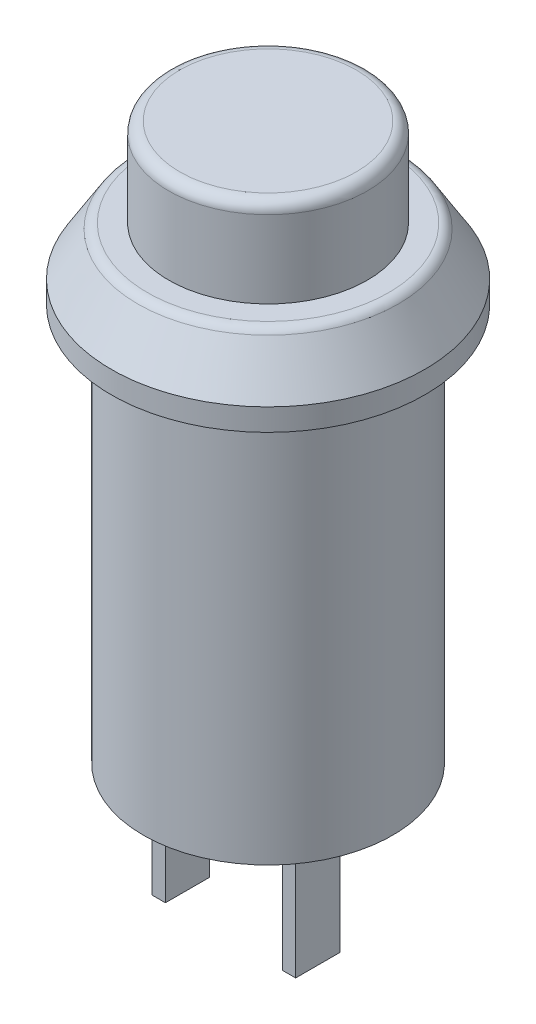
ISO-10303-21;
HEADER;
FILE_DESCRIPTION(('STEP AP214'),'2;1');
FILE_NAME('part.step','',(''),(''),'','','');
FILE_SCHEMA(('AUTOMOTIVE_DESIGN { 1 0 10303 214 1 1 1 1 }'));
ENDSEC;
DATA;
#1=APPLICATION_CONTEXT('core data for automotive mechanical design processes');
#2=APPLICATION_PROTOCOL_DEFINITION('international standard','automotive_design',2000,#1);
#3=PRODUCT_CONTEXT('',#1,'mechanical');
#4=PRODUCT('Part','Part','',(#3));
#5=PRODUCT_RELATED_PRODUCT_CATEGORY('part','',(#4));
#6=PRODUCT_DEFINITION_FORMATION('','',#4);
#7=PRODUCT_DEFINITION_CONTEXT('part definition',#1,'design');
#8=PRODUCT_DEFINITION('design','',#6,#7);
#9=PRODUCT_DEFINITION_SHAPE('','',#8);
#10=(LENGTH_UNIT() NAMED_UNIT(*) SI_UNIT(.MILLI.,.METRE.));
#11=(NAMED_UNIT(*) PLANE_ANGLE_UNIT() SI_UNIT($,.RADIAN.));
#12=(NAMED_UNIT(*) SI_UNIT($,.STERADIAN.) SOLID_ANGLE_UNIT());
#13=UNCERTAINTY_MEASURE_WITH_UNIT(LENGTH_MEASURE(1.E-05),#10,'distance_accuracy_value','');
#14=(GEOMETRIC_REPRESENTATION_CONTEXT(3) GLOBAL_UNCERTAINTY_ASSIGNED_CONTEXT((#13)) GLOBAL_UNIT_ASSIGNED_CONTEXT((#10,
#11,#12)) REPRESENTATION_CONTEXT('',''));
#15=CARTESIAN_POINT('',(0.,0.,0.));
#16=DIRECTION('',(0.,0.,1.));
#17=DIRECTION('',(1.,0.,0.));
#18=AXIS2_PLACEMENT_3D('',#15,#16,#17);
#19=CARTESIAN_POINT('',(0.,0.,0.));
#20=DIRECTION('',(0.,1.,0.));
#21=DIRECTION('',(0.,0.,1.));
#22=AXIS2_PLACEMENT_3D('',#19,#20,#21);
#23=PLANE('',#22);
#24=DIRECTION('',(0.,0.,1.));
#25=VECTOR('',#24,1.);
#26=CARTESIAN_POINT('',(3.25,0.,0.));
#27=LINE('',#26,#25);
#28=CARTESIAN_POINT('',(3.25,0.,0.));
#29=VERTEX_POINT('',#28);
#30=CARTESIAN_POINT('',(3.25,0.,2.));
#31=VERTEX_POINT('',#30);
#32=EDGE_CURVE('E119',#29,#31,#27,.T.);
#33=ORIENTED_EDGE('',*,*,#32,.F.);
#34=DIRECTION('',(1.,0.,0.));
#35=VECTOR('',#34,1.);
#36=CARTESIAN_POINT('',(3.25,0.,0.));
#37=LINE('',#36,#35);
#38=CARTESIAN_POINT('',(2.65,0.,0.));
#39=VERTEX_POINT('',#38);
#40=EDGE_CURVE('E132',#39,#29,#37,.T.);
#41=ORIENTED_EDGE('',*,*,#40,.F.);
#42=DIRECTION('',(0.,0.,-1.));
#43=VECTOR('',#42,1.);
#44=CARTESIAN_POINT('',(2.65,0.,0.));
#45=LINE('',#44,#43);
#46=CARTESIAN_POINT('',(2.65,0.,2.));
#47=VERTEX_POINT('',#46);
#48=EDGE_CURVE('E141',#47,#39,#45,.T.);
#49=ORIENTED_EDGE('',*,*,#48,.F.);
#50=DIRECTION('',(-1.,0.,0.));
#51=VECTOR('',#50,1.);
#52=CARTESIAN_POINT('',(3.25,0.,2.));
#53=LINE('',#52,#51);
#54=EDGE_CURVE('E122',#31,#47,#53,.T.);
#55=ORIENTED_EDGE('',*,*,#54,.F.);
#56=EDGE_LOOP('',(#33,#41,#49,#55));
#57=FACE_BOUND('',#56,.T.);
#58=CARTESIAN_POINT('',(0.,0.,0.));
#59=DIRECTION('',(0.,-1.,0.));
#60=DIRECTION('',(0.,0.,-1.));
#61=AXIS2_PLACEMENT_3D('',#58,#59,#60);
#62=CIRCLE('',#61,5.65);
#63=CARTESIAN_POINT('',(0.,0.,-5.65));
#64=VERTEX_POINT('',#63);
#65=EDGE_CURVE('E169',#64,#64,#62,.T.);
#66=ORIENTED_EDGE('',*,*,#65,.T.);
#67=EDGE_LOOP('',(#66));
#68=FACE_BOUND('',#67,.T.);
#69=DIRECTION('',(0.,0.,-1.));
#70=VECTOR('',#69,1.);
#71=CARTESIAN_POINT('',(-3.25,0.,0.));
#72=LINE('',#71,#70);
#73=CARTESIAN_POINT('',(-3.25,0.,2.));
#74=VERTEX_POINT('',#73);
#75=CARTESIAN_POINT('',(-3.25,0.,0.));
#76=VERTEX_POINT('',#75);
#77=EDGE_CURVE('E118',#74,#76,#72,.T.);
#78=ORIENTED_EDGE('',*,*,#77,.F.);
#79=DIRECTION('',(-1.,0.,0.));
#80=VECTOR('',#79,1.);
#81=CARTESIAN_POINT('',(-3.25,0.,2.));
#82=LINE('',#81,#80);
#83=CARTESIAN_POINT('',(-2.65,0.,2.));
#84=VERTEX_POINT('',#83);
#85=EDGE_CURVE('E115',#84,#74,#82,.T.);
#86=ORIENTED_EDGE('',*,*,#85,.F.);
#87=DIRECTION('',(0.,0.,1.));
#88=VECTOR('',#87,1.);
#89=CARTESIAN_POINT('',(-2.65,0.,0.));
#90=LINE('',#89,#88);
#91=CARTESIAN_POINT('',(-2.65,0.,0.));
#92=VERTEX_POINT('',#91);
#93=EDGE_CURVE('E53',#92,#84,#90,.T.);
#94=ORIENTED_EDGE('',*,*,#93,.F.);
#95=DIRECTION('',(1.,0.,0.));
#96=VECTOR('',#95,1.);
#97=CARTESIAN_POINT('',(-3.25,0.,0.));
#98=LINE('',#97,#96);
#99=EDGE_CURVE('E48',#76,#92,#98,.T.);
#100=ORIENTED_EDGE('',*,*,#99,.F.);
#101=EDGE_LOOP('',(#78,#86,#94,#100));
#102=FACE_BOUND('',#101,.T.);
#103=ADVANCED_FACE('F33',(#57,#68,#102),#23,.F.);
#104=CARTESIAN_POINT('',(0.,0.,0.));
#105=DIRECTION('',(0.,-1.,0.));
#106=DIRECTION('',(0.,0.,-1.));
#107=AXIS2_PLACEMENT_3D('',#104,#105,#106);
#108=CYLINDRICAL_SURFACE('',#107,5.65);
#109=ORIENTED_EDGE('',*,*,#65,.F.);
#110=EDGE_LOOP('',(#109));
#111=FACE_BOUND('',#110,.T.);
#112=CARTESIAN_POINT('',(0.,18.,0.));
#113=DIRECTION('',(0.,-1.,0.));
#114=DIRECTION('',(0.,0.,-1.));
#115=AXIS2_PLACEMENT_3D('',#112,#113,#114);
#116=CIRCLE('',#115,5.65);
#117=CARTESIAN_POINT('',(0.,18.,-5.65));
#118=VERTEX_POINT('',#117);
#119=EDGE_CURVE('E166',#118,#118,#116,.T.);
#120=ORIENTED_EDGE('',*,*,#119,.T.);
#121=EDGE_LOOP('',(#120));
#122=FACE_BOUND('',#121,.T.);
#123=ADVANCED_FACE('F198',(#111,#122),#108,.T.);
#124=CARTESIAN_POINT('',(-5.65,18.,0.));
#125=DIRECTION('',(0.,1.,0.));
#126=DIRECTION('',(0.,0.,1.));
#127=AXIS2_PLACEMENT_3D('',#124,#125,#126);
#128=PLANE('',#127);
#129=ORIENTED_EDGE('',*,*,#119,.F.);
#130=EDGE_LOOP('',(#129));
#131=FACE_BOUND('',#130,.T.);
#132=CARTESIAN_POINT('',(0.,18.,0.));
#133=DIRECTION('',(0.,-1.,0.));
#134=DIRECTION('',(0.,0.,-1.));
#135=AXIS2_PLACEMENT_3D('',#132,#133,#134);
#136=CIRCLE('',#135,7.1);
#137=CARTESIAN_POINT('',(0.,18.,-7.1));
#138=VERTEX_POINT('',#137);
#139=EDGE_CURVE('E163',#138,#138,#136,.T.);
#140=ORIENTED_EDGE('',*,*,#139,.T.);
#141=EDGE_LOOP('',(#140));
#142=FACE_BOUND('',#141,.T.);
#143=ADVANCED_FACE('F204',(#131,#142),#128,.F.);
#144=CARTESIAN_POINT('',(0.,0.,0.));
#145=DIRECTION('',(0.,-1.,0.));
#146=DIRECTION('',(0.,0.,-1.));
#147=AXIS2_PLACEMENT_3D('',#144,#145,#146);
#148=CYLINDRICAL_SURFACE('',#147,7.1);
#149=ORIENTED_EDGE('',*,*,#139,.F.);
#150=EDGE_LOOP('',(#149));
#151=FACE_BOUND('',#150,.T.);
#152=CARTESIAN_POINT('',(0.,19.,0.));
#153=DIRECTION('',(0.,-1.,0.));
#154=DIRECTION('',(0.,0.,-1.));
#155=AXIS2_PLACEMENT_3D('',#152,#153,#154);
#156=CIRCLE('',#155,7.1);
#157=CARTESIAN_POINT('',(0.,19.,-7.1));
#158=VERTEX_POINT('',#157);
#159=EDGE_CURVE('E160',#158,#158,#156,.T.);
#160=ORIENTED_EDGE('',*,*,#159,.T.);
#161=EDGE_LOOP('',(#160));
#162=FACE_BOUND('',#161,.T.);
#163=ADVANCED_FACE('F211',(#151,#162),#148,.T.);
#164=CARTESIAN_POINT('',(0.,21.2,0.));
#165=DIRECTION('',(0.,-1.,0.));
#166=DIRECTION('',(0.,0.,-1.));
#167=AXIS2_PLACEMENT_3D('',#164,#165,#166);
#168=CONICAL_SURFACE('',#167,5.75,0.550385947676791);
#169=CARTESIAN_POINT('',(0.,20.9615081099263,0.));
#170=DIRECTION('',(0.,1.,0.));
#171=DIRECTION('',(0.,0.,1.));
#172=AXIS2_PLACEMENT_3D('',#169,#170,#171);
#173=CIRCLE('',#172,5.89634729618159);
#174=CARTESIAN_POINT('',(0.,20.9615081099263,5.89634729618159));
#175=VERTEX_POINT('',#174);
#176=EDGE_CURVE('E172',#175,#175,#173,.F.);
#177=ORIENTED_EDGE('',*,*,#176,.T.);
#178=EDGE_LOOP('',(#177));
#179=FACE_BOUND('',#178,.T.);
#180=ORIENTED_EDGE('',*,*,#159,.F.);
#181=EDGE_LOOP('',(#180));
#182=FACE_BOUND('',#181,.T.);
#183=ADVANCED_FACE('F215',(#179,#182),#168,.T.);
#184=CARTESIAN_POINT('',(-4.5,21.2,0.));
#185=DIRECTION('',(0.,-1.,0.));
#186=DIRECTION('',(0.,0.,-1.));
#187=AXIS2_PLACEMENT_3D('',#184,#185,#186);
#188=PLANE('',#187);
#189=CARTESIAN_POINT('',(0.,21.2,0.));
#190=DIRECTION('',(0.,-1.,0.));
#191=DIRECTION('',(0.,0.,-1.));
#192=AXIS2_PLACEMENT_3D('',#189,#190,#191);
#193=CIRCLE('',#192,5.47018593185726);
#194=CARTESIAN_POINT('',(0.,21.2,-5.47018593185726));
#195=VERTEX_POINT('',#194);
#196=EDGE_CURVE('E175',#195,#195,#193,.F.);
#197=ORIENTED_EDGE('',*,*,#196,.T.);
#198=EDGE_LOOP('',(#197));
#199=FACE_BOUND('',#198,.T.);
#200=CARTESIAN_POINT('',(0.,21.2,0.));
#201=DIRECTION('',(0.,-1.,0.));
#202=DIRECTION('',(0.,0.,-1.));
#203=AXIS2_PLACEMENT_3D('',#200,#201,#202);
#204=CIRCLE('',#203,4.5);
#205=CARTESIAN_POINT('',(0.,21.2,-4.5));
#206=VERTEX_POINT('',#205);
#207=EDGE_CURVE('E157',#206,#206,#204,.T.);
#208=ORIENTED_EDGE('',*,*,#207,.T.);
#209=EDGE_LOOP('',(#208));
#210=FACE_BOUND('',#209,.T.);
#211=ADVANCED_FACE('F219',(#199,#210),#188,.F.);
#212=CARTESIAN_POINT('',(0.,0.,0.));
#213=DIRECTION('',(0.,-1.,0.));
#214=DIRECTION('',(0.,0.,-1.));
#215=AXIS2_PLACEMENT_3D('',#212,#213,#214);
#216=CYLINDRICAL_SURFACE('',#215,4.5);
#217=CARTESIAN_POINT('',(0.,24.7,0.));
#218=DIRECTION('',(0.,-1.,0.));
#219=DIRECTION('',(0.,0.,-1.));
#220=AXIS2_PLACEMENT_3D('',#217,#218,#219);
#221=CIRCLE('',#220,4.5);
#222=CARTESIAN_POINT('',(0.,24.7,-4.5));
#223=VERTEX_POINT('',#222);
#224=EDGE_CURVE('E41',#223,#223,#221,.T.);
#225=ORIENTED_EDGE('',*,*,#224,.T.);
#226=EDGE_LOOP('',(#225));
#227=FACE_BOUND('',#226,.T.);
#228=ORIENTED_EDGE('',*,*,#207,.F.);
#229=EDGE_LOOP('',(#228));
#230=FACE_BOUND('',#229,.T.);
#231=ADVANCED_FACE('F180',(#227,#230),#216,.T.);
#232=CARTESIAN_POINT('',(-4.5,25.2,0.));
#233=DIRECTION('',(0.,-1.,0.));
#234=DIRECTION('',(0.,0.,-1.));
#235=AXIS2_PLACEMENT_3D('',#232,#233,#234);
#236=PLANE('',#235);
#237=CARTESIAN_POINT('',(0.,25.2,0.));
#238=DIRECTION('',(0.,-1.,0.));
#239=DIRECTION('',(0.,0.,-1.));
#240=AXIS2_PLACEMENT_3D('',#237,#238,#239);
#241=CIRCLE('',#240,4.);
#242=CARTESIAN_POINT('',(0.,25.2,-4.));
#243=VERTEX_POINT('',#242);
#244=EDGE_CURVE('E11',#243,#243,#241,.F.);
#245=ORIENTED_EDGE('',*,*,#244,.T.);
#246=EDGE_LOOP('',(#245));
#247=FACE_BOUND('',#246,.T.);
#248=ADVANCED_FACE('F194',(#247),#236,.F.);
#249=CARTESIAN_POINT('',(0.,20.7,0.));
#250=DIRECTION('',(0.,-1.,0.));
#251=DIRECTION('',(0.,0.,-1.));
#252=AXIS2_PLACEMENT_3D('',#249,#250,#251);
#253=TOROIDAL_SURFACE('',#252,5.47018593185726,0.5);
#254=ORIENTED_EDGE('',*,*,#196,.F.);
#255=EDGE_LOOP('',(#254));
#256=FACE_BOUND('',#255,.T.);
#257=ORIENTED_EDGE('',*,*,#176,.F.);
#258=EDGE_LOOP('',(#257));
#259=FACE_BOUND('',#258,.T.);
#260=ADVANCED_FACE('F185',(#256,#259),#253,.T.);
#261=CARTESIAN_POINT('',(0.,24.7,0.));
#262=DIRECTION('',(0.,-1.,0.));
#263=DIRECTION('',(0.,0.,-1.));
#264=AXIS2_PLACEMENT_3D('',#261,#262,#263);
#265=TOROIDAL_SURFACE('',#264,4.,0.5);
#266=ORIENTED_EDGE('',*,*,#244,.F.);
#267=EDGE_LOOP('',(#266));
#268=FACE_BOUND('',#267,.T.);
#269=ORIENTED_EDGE('',*,*,#224,.F.);
#270=EDGE_LOOP('',(#269));
#271=FACE_BOUND('',#270,.T.);
#272=ADVANCED_FACE('F35',(#268,#271),#265,.T.);
#273=CARTESIAN_POINT('',(3.25,-5.8,0.));
#274=DIRECTION('',(-1.,0.,0.));
#275=DIRECTION('',(0.,0.,1.));
#276=AXIS2_PLACEMENT_3D('',#273,#274,#275);
#277=PLANE('',#276);
#278=ORIENTED_EDGE('',*,*,#32,.T.);
#279=DIRECTION('',(0.,1.,0.));
#280=VECTOR('',#279,1.);
#281=CARTESIAN_POINT('',(3.25,-5.8,2.));
#282=LINE('',#281,#280);
#283=CARTESIAN_POINT('',(3.25,-5.8,2.));
#284=VERTEX_POINT('',#283);
#285=EDGE_CURVE('E154',#284,#31,#282,.T.);
#286=ORIENTED_EDGE('',*,*,#285,.F.);
#287=DIRECTION('',(0.,0.,1.));
#288=VECTOR('',#287,1.);
#289=CARTESIAN_POINT('',(3.25,-5.8,0.));
#290=LINE('',#289,#288);
#291=CARTESIAN_POINT('',(3.25,-5.8,0.));
#292=VERTEX_POINT('',#291);
#293=EDGE_CURVE('E128',#292,#284,#290,.T.);
#294=ORIENTED_EDGE('',*,*,#293,.F.);
#295=DIRECTION('',(0.,1.,0.));
#296=VECTOR('',#295,1.);
#297=CARTESIAN_POINT('',(3.25,-5.8,0.));
#298=LINE('',#297,#296);
#299=EDGE_CURVE('E137',#292,#29,#298,.T.);
#300=ORIENTED_EDGE('',*,*,#299,.T.);
#301=EDGE_LOOP('',(#278,#286,#294,#300));
#302=FACE_BOUND('',#301,.T.);
#303=ADVANCED_FACE('F184',(#302),#277,.F.);
#304=CARTESIAN_POINT('',(3.25,-5.8,2.));
#305=DIRECTION('',(0.,0.,-1.));
#306=DIRECTION('',(-1.,0.,0.));
#307=AXIS2_PLACEMENT_3D('',#304,#305,#306);
#308=PLANE('',#307);
#309=ORIENTED_EDGE('',*,*,#54,.T.);
#310=DIRECTION('',(0.,1.,0.));
#311=VECTOR('',#310,1.);
#312=CARTESIAN_POINT('',(2.65,-5.8,2.));
#313=LINE('',#312,#311);
#314=CARTESIAN_POINT('',(2.65,-5.8,2.));
#315=VERTEX_POINT('',#314);
#316=EDGE_CURVE('E151',#315,#47,#313,.T.);
#317=ORIENTED_EDGE('',*,*,#316,.F.);
#318=DIRECTION('',(-1.,0.,0.));
#319=VECTOR('',#318,1.);
#320=CARTESIAN_POINT('',(3.25,-5.8,2.));
#321=LINE('',#320,#319);
#322=EDGE_CURVE('E131',#284,#315,#321,.T.);
#323=ORIENTED_EDGE('',*,*,#322,.F.);
#324=ORIENTED_EDGE('',*,*,#285,.T.);
#325=EDGE_LOOP('',(#309,#317,#323,#324));
#326=FACE_BOUND('',#325,.T.);
#327=ADVANCED_FACE('F191',(#326),#308,.F.);
#328=CARTESIAN_POINT('',(2.65,-5.8,0.));
#329=DIRECTION('',(1.,0.,0.));
#330=DIRECTION('',(0.,0.,-1.));
#331=AXIS2_PLACEMENT_3D('',#328,#329,#330);
#332=PLANE('',#331);
#333=ORIENTED_EDGE('',*,*,#48,.T.);
#334=DIRECTION('',(0.,1.,0.));
#335=VECTOR('',#334,1.);
#336=CARTESIAN_POINT('',(2.65,-5.8,0.));
#337=LINE('',#336,#335);
#338=CARTESIAN_POINT('',(2.65,-5.8,0.));
#339=VERTEX_POINT('',#338);
#340=EDGE_CURVE('E148',#339,#39,#337,.T.);
#341=ORIENTED_EDGE('',*,*,#340,.F.);
#342=DIRECTION('',(0.,0.,-1.));
#343=VECTOR('',#342,1.);
#344=CARTESIAN_POINT('',(2.65,-5.8,0.));
#345=LINE('',#344,#343);
#346=EDGE_CURVE('E134',#315,#339,#345,.T.);
#347=ORIENTED_EDGE('',*,*,#346,.F.);
#348=ORIENTED_EDGE('',*,*,#316,.T.);
#349=EDGE_LOOP('',(#333,#341,#347,#348));
#350=FACE_BOUND('',#349,.T.);
#351=ADVANCED_FACE('F231',(#350),#332,.F.);
#352=CARTESIAN_POINT('',(3.25,-5.8,0.));
#353=DIRECTION('',(0.,0.,1.));
#354=DIRECTION('',(1.,0.,0.));
#355=AXIS2_PLACEMENT_3D('',#352,#353,#354);
#356=PLANE('',#355);
#357=ORIENTED_EDGE('',*,*,#40,.T.);
#358=ORIENTED_EDGE('',*,*,#299,.F.);
#359=DIRECTION('',(1.,0.,0.));
#360=VECTOR('',#359,1.);
#361=CARTESIAN_POINT('',(3.25,-5.8,0.));
#362=LINE('',#361,#360);
#363=EDGE_CURVE('E136',#339,#292,#362,.T.);
#364=ORIENTED_EDGE('',*,*,#363,.F.);
#365=ORIENTED_EDGE('',*,*,#340,.T.);
#366=EDGE_LOOP('',(#357,#358,#364,#365));
#367=FACE_BOUND('',#366,.T.);
#368=ADVANCED_FACE('F235',(#367),#356,.F.);
#369=CARTESIAN_POINT('',(0.,-5.8,0.));
#370=DIRECTION('',(0.,-1.,0.));
#371=DIRECTION('',(0.,0.,-1.));
#372=AXIS2_PLACEMENT_3D('',#369,#370,#371);
#373=PLANE('',#372);
#374=ORIENTED_EDGE('',*,*,#293,.T.);
#375=ORIENTED_EDGE('',*,*,#322,.T.);
#376=ORIENTED_EDGE('',*,*,#346,.T.);
#377=ORIENTED_EDGE('',*,*,#363,.T.);
#378=EDGE_LOOP('',(#374,#375,#376,#377));
#379=FACE_BOUND('',#378,.T.);
#380=ADVANCED_FACE('F239',(#379),#373,.T.);
#381=CARTESIAN_POINT('',(-3.25,-5.8,0.));
#382=DIRECTION('',(1.,0.,0.));
#383=DIRECTION('',(0.,0.,-1.));
#384=AXIS2_PLACEMENT_3D('',#381,#382,#383);
#385=PLANE('',#384);
#386=ORIENTED_EDGE('',*,*,#77,.T.);
#387=DIRECTION('',(0.,1.,0.));
#388=VECTOR('',#387,1.);
#389=CARTESIAN_POINT('',(-3.25,-5.8,0.));
#390=LINE('',#389,#388);
#391=CARTESIAN_POINT('',(-3.25,-5.8,0.));
#392=VERTEX_POINT('',#391);
#393=EDGE_CURVE('E99',#392,#76,#390,.T.);
#394=ORIENTED_EDGE('',*,*,#393,.F.);
#395=DIRECTION('',(0.,0.,-1.));
#396=VECTOR('',#395,1.);
#397=CARTESIAN_POINT('',(-3.25,-5.8,0.));
#398=LINE('',#397,#396);
#399=CARTESIAN_POINT('',(-3.25,-5.8,2.));
#400=VERTEX_POINT('',#399);
#401=EDGE_CURVE('E106',#400,#392,#398,.T.);
#402=ORIENTED_EDGE('',*,*,#401,.F.);
#403=DIRECTION('',(0.,1.,0.));
#404=VECTOR('',#403,1.);
#405=CARTESIAN_POINT('',(-3.25,-5.8,2.));
#406=LINE('',#405,#404);
#407=EDGE_CURVE('E375',#400,#74,#406,.T.);
#408=ORIENTED_EDGE('',*,*,#407,.T.);
#409=EDGE_LOOP('',(#386,#394,#402,#408));
#410=FACE_BOUND('',#409,.T.);
#411=ADVANCED_FACE('F117',(#410),#385,.F.);
#412=CARTESIAN_POINT('',(-3.25,-5.8,0.));
#413=DIRECTION('',(0.,0.,1.));
#414=DIRECTION('',(1.,0.,0.));
#415=AXIS2_PLACEMENT_3D('',#412,#413,#414);
#416=PLANE('',#415);
#417=ORIENTED_EDGE('',*,*,#99,.T.);
#418=DIRECTION('',(0.,1.,0.));
#419=VECTOR('',#418,1.);
#420=CARTESIAN_POINT('',(-2.65,-5.8,0.));
#421=LINE('',#420,#419);
#422=CARTESIAN_POINT('',(-2.65,-5.8,0.));
#423=VERTEX_POINT('',#422);
#424=EDGE_CURVE('E102',#423,#92,#421,.T.);
#425=ORIENTED_EDGE('',*,*,#424,.F.);
#426=DIRECTION('',(1.,0.,0.));
#427=VECTOR('',#426,1.);
#428=CARTESIAN_POINT('',(-3.25,-5.8,0.));
#429=LINE('',#428,#427);
#430=EDGE_CURVE('E95',#392,#423,#429,.T.);
#431=ORIENTED_EDGE('',*,*,#430,.F.);
#432=ORIENTED_EDGE('',*,*,#393,.T.);
#433=EDGE_LOOP('',(#417,#425,#431,#432));
#434=FACE_BOUND('',#433,.T.);
#435=ADVANCED_FACE('F97',(#434),#416,.F.);
#436=CARTESIAN_POINT('',(-2.65,-5.8,0.));
#437=DIRECTION('',(-1.,0.,0.));
#438=DIRECTION('',(0.,0.,1.));
#439=AXIS2_PLACEMENT_3D('',#436,#437,#438);
#440=PLANE('',#439);
#441=ORIENTED_EDGE('',*,*,#93,.T.);
#442=DIRECTION('',(0.,1.,0.));
#443=VECTOR('',#442,1.);
#444=CARTESIAN_POINT('',(-2.65,-5.8,2.));
#445=LINE('',#444,#443);
#446=CARTESIAN_POINT('',(-2.65,-5.8,2.));
#447=VERTEX_POINT('',#446);
#448=EDGE_CURVE('E124',#447,#84,#445,.T.);
#449=ORIENTED_EDGE('',*,*,#448,.F.);
#450=DIRECTION('',(0.,0.,1.));
#451=VECTOR('',#450,1.);
#452=CARTESIAN_POINT('',(-2.65,-5.8,0.));
#453=LINE('',#452,#451);
#454=EDGE_CURVE('E105',#423,#447,#453,.T.);
#455=ORIENTED_EDGE('',*,*,#454,.F.);
#456=ORIENTED_EDGE('',*,*,#424,.T.);
#457=EDGE_LOOP('',(#441,#449,#455,#456));
#458=FACE_BOUND('',#457,.T.);
#459=ADVANCED_FACE('F248',(#458),#440,.F.);
#460=CARTESIAN_POINT('',(-3.25,-5.8,2.));
#461=DIRECTION('',(0.,0.,-1.));
#462=DIRECTION('',(-1.,0.,0.));
#463=AXIS2_PLACEMENT_3D('',#460,#461,#462);
#464=PLANE('',#463);
#465=ORIENTED_EDGE('',*,*,#85,.T.);
#466=ORIENTED_EDGE('',*,*,#407,.F.);
#467=DIRECTION('',(-1.,0.,0.));
#468=VECTOR('',#467,1.);
#469=CARTESIAN_POINT('',(-3.25,-5.8,2.));
#470=LINE('',#469,#468);
#471=EDGE_CURVE('E111',#447,#400,#470,.T.);
#472=ORIENTED_EDGE('',*,*,#471,.F.);
#473=ORIENTED_EDGE('',*,*,#448,.T.);
#474=EDGE_LOOP('',(#465,#466,#472,#473));
#475=FACE_BOUND('',#474,.T.);
#476=ADVANCED_FACE('F251',(#475),#464,.F.);
#477=CARTESIAN_POINT('',(0.,-5.8,0.));
#478=DIRECTION('',(0.,1.,0.));
#479=DIRECTION('',(0.,0.,1.));
#480=AXIS2_PLACEMENT_3D('',#477,#478,#479);
#481=PLANE('',#480);
#482=ORIENTED_EDGE('',*,*,#401,.T.);
#483=ORIENTED_EDGE('',*,*,#430,.T.);
#484=ORIENTED_EDGE('',*,*,#454,.T.);
#485=ORIENTED_EDGE('',*,*,#471,.T.);
#486=EDGE_LOOP('',(#482,#483,#484,#485));
#487=FACE_BOUND('',#486,.T.);
#488=ADVANCED_FACE('F109',(#487),#481,.F.);
#489=CLOSED_SHELL('',(#103,#123,#143,#163,#183,#211,#231,#248,#260,#272,#303,#327,#351,#368,
#380,#411,#435,#459,#476,#488));
#490=MANIFOLD_SOLID_BREP('B2',#489);
#491=ADVANCED_BREP_SHAPE_REPRESENTATION('',(#18,#490),#14);
#492=SHAPE_DEFINITION_REPRESENTATION(#9,#491);
ENDSEC;
END-ISO-10303-21;
